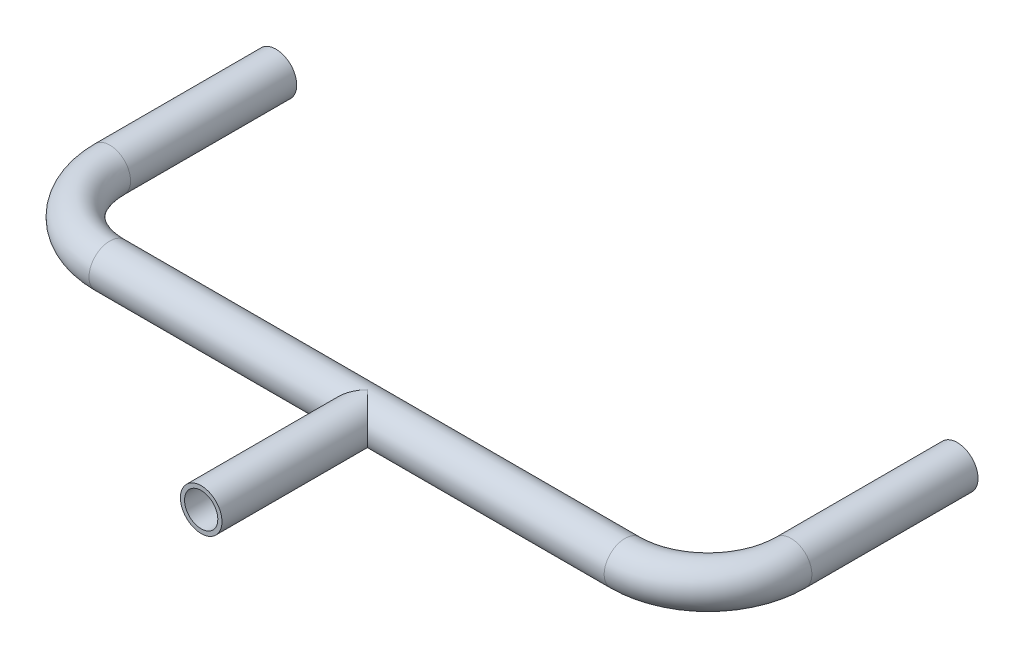
ISO-10303-21;
HEADER;
FILE_DESCRIPTION(('STEP AP214'),'2;1');
FILE_NAME('part.step','',(''),(''),'','','');
FILE_SCHEMA(('AUTOMOTIVE_DESIGN { 1 0 10303 214 1 1 1 1 }'));
ENDSEC;
DATA;
#1=APPLICATION_CONTEXT('core data for automotive mechanical design processes');
#2=APPLICATION_PROTOCOL_DEFINITION('international standard','automotive_design',2000,#1);
#3=PRODUCT_CONTEXT('',#1,'mechanical');
#4=PRODUCT('Part','Part','',(#3));
#5=PRODUCT_RELATED_PRODUCT_CATEGORY('part','',(#4));
#6=PRODUCT_DEFINITION_FORMATION('','',#4);
#7=PRODUCT_DEFINITION_CONTEXT('part definition',#1,'design');
#8=PRODUCT_DEFINITION('design','',#6,#7);
#9=PRODUCT_DEFINITION_SHAPE('','',#8);
#10=(LENGTH_UNIT() NAMED_UNIT(*) SI_UNIT(.MILLI.,.METRE.));
#11=(NAMED_UNIT(*) PLANE_ANGLE_UNIT() SI_UNIT($,.RADIAN.));
#12=(NAMED_UNIT(*) SI_UNIT($,.STERADIAN.) SOLID_ANGLE_UNIT());
#13=UNCERTAINTY_MEASURE_WITH_UNIT(LENGTH_MEASURE(1.E-05),#10,'distance_accuracy_value','');
#14=(GEOMETRIC_REPRESENTATION_CONTEXT(3) GLOBAL_UNCERTAINTY_ASSIGNED_CONTEXT((#13)) GLOBAL_UNIT_ASSIGNED_CONTEXT((#10,
#11,#12)) REPRESENTATION_CONTEXT('',''));
#15=CARTESIAN_POINT('',(0.,0.,0.));
#16=DIRECTION('',(0.,0.,1.));
#17=DIRECTION('',(1.,0.,0.));
#18=AXIS2_PLACEMENT_3D('',#15,#16,#17);
#19=CARTESIAN_POINT('',(-31.,0.,30.));
#20=DIRECTION('',(1.,0.,0.));
#21=DIRECTION('',(0.,0.,-1.));
#22=AXIS2_PLACEMENT_3D('',#19,#20,#21);
#23=CYLINDRICAL_SURFACE('',#22,2.5);
#24=CARTESIAN_POINT('',(31.,0.,30.));
#25=DIRECTION('',(1.,0.,0.));
#26=DIRECTION('',(0.,0.,-1.));
#27=AXIS2_PLACEMENT_3D('',#24,#25,#26);
#28=CIRCLE('',#27,2.5);
#29=CARTESIAN_POINT('',(31.,0.,32.5));
#30=VERTEX_POINT('',#29);
#31=EDGE_CURVE('E122',#30,#30,#28,.T.);
#32=ORIENTED_EDGE('',*,*,#31,.F.);
#33=EDGE_LOOP('',(#32));
#34=FACE_BOUND('',#33,.T.);
#35=CARTESIAN_POINT('',(-31.,0.,30.));
#36=DIRECTION('',(1.,0.,0.));
#37=DIRECTION('',(0.,0.,-1.));
#38=AXIS2_PLACEMENT_3D('',#35,#36,#37);
#39=CIRCLE('',#38,2.5);
#40=CARTESIAN_POINT('',(-31.,0.,32.5));
#41=VERTEX_POINT('',#40);
#42=EDGE_CURVE('E91',#41,#41,#39,.T.);
#43=ORIENTED_EDGE('',*,*,#42,.T.);
#44=EDGE_LOOP('',(#43));
#45=FACE_BOUND('',#44,.T.);
#46=CARTESIAN_POINT('',(0.,0.,30.));
#47=DIRECTION('',(0.707106781186547,0.,0.707106781186547));
#48=DIRECTION('',(0.707106781186547,0.,-0.707106781186547));
#49=AXIS2_PLACEMENT_3D('',#46,#47,#48);
#50=ELLIPSE('',#49,3.53553390593274,2.5);
#51=CARTESIAN_POINT('',(0.,-2.5,30.));
#52=VERTEX_POINT('',#51);
#53=CARTESIAN_POINT('',(0.,2.5,30.));
#54=VERTEX_POINT('',#53);
#55=EDGE_CURVE('E80',#52,#54,#50,.F.);
#56=ORIENTED_EDGE('',*,*,#55,.T.);
#57=CARTESIAN_POINT('',(0.,0.,30.));
#58=DIRECTION('',(0.707106781186547,0.,-0.707106781186547));
#59=DIRECTION('',(0.707106781186547,0.,0.707106781186547));
#60=AXIS2_PLACEMENT_3D('',#57,#58,#59);
#61=ELLIPSE('',#60,3.53553390593274,2.5);
#62=EDGE_CURVE('E84',#54,#52,#61,.T.);
#63=ORIENTED_EDGE('',*,*,#62,.T.);
#64=EDGE_LOOP('',(#56,#63));
#65=FACE_BOUND('',#64,.T.);
#66=ADVANCED_FACE('F32',(#34,#45,#65),#23,.T.);
#67=CARTESIAN_POINT('',(-31.,0.,30.));
#68=DIRECTION('',(1.,0.,0.));
#69=DIRECTION('',(0.,0.,-1.));
#70=AXIS2_PLACEMENT_3D('',#67,#68,#69);
#71=CYLINDRICAL_SURFACE('',#70,2.);
#72=CARTESIAN_POINT('',(31.,0.,30.));
#73=DIRECTION('',(1.,0.,0.));
#74=DIRECTION('',(0.,0.,-1.));
#75=AXIS2_PLACEMENT_3D('',#72,#73,#74);
#76=CIRCLE('',#75,2.);
#77=CARTESIAN_POINT('',(31.,0.,32.));
#78=VERTEX_POINT('',#77);
#79=EDGE_CURVE('E104',#78,#78,#76,.F.);
#80=ORIENTED_EDGE('',*,*,#79,.F.);
#81=EDGE_LOOP('',(#80));
#82=FACE_BOUND('',#81,.T.);
#83=CARTESIAN_POINT('',(-31.,0.,30.));
#84=DIRECTION('',(1.,0.,0.));
#85=DIRECTION('',(0.,0.,-1.));
#86=AXIS2_PLACEMENT_3D('',#83,#84,#85);
#87=CIRCLE('',#86,2.);
#88=CARTESIAN_POINT('',(-31.,0.,32.));
#89=VERTEX_POINT('',#88);
#90=EDGE_CURVE('E101',#89,#89,#87,.F.);
#91=ORIENTED_EDGE('',*,*,#90,.T.);
#92=EDGE_LOOP('',(#91));
#93=FACE_BOUND('',#92,.T.);
#94=CARTESIAN_POINT('',(-1.5,2.,30.));
#95=CARTESIAN_POINT('',(-1.49998071670638,2.00000627516937,30.0379479235646));
#96=CARTESIAN_POINT('',(-1.50144137076645,1.99891949492476,30.075871512533));
#97=CARTESIAN_POINT('',(-1.50714933485683,1.99462303531532,30.1513246169431));
#98=CARTESIAN_POINT('',(-1.51139191730073,1.99141695739297,30.1888546913848));
#99=CARTESIAN_POINT('',(-1.52788746872243,1.97882613787581,30.2994987253815));
#100=CARTESIAN_POINT('',(-1.54391814844851,1.96646480032562,30.3717328446597));
#101=CARTESIAN_POINT('',(-1.59071544702264,1.92893517586303,30.5374091033952));
#102=CARTESIAN_POINT('',(-1.6246999511635,1.90076994665306,30.629214039076));
#103=CARTESIAN_POINT('',(-1.70075265542759,1.83304379692473,30.8055806251053));
#104=CARTESIAN_POINT('',(-1.7428794008736,1.79339924041708,30.8900829810822));
#105=CARTESIAN_POINT('',(-1.81651421244187,1.71816854919065,31.0255826282879));
#106=CARTESIAN_POINT('',(-1.84710697283324,1.6853426756765,31.0786491229795));
#107=CARTESIAN_POINT('',(-1.90886067652254,1.61506745369567,31.181282951485));
#108=CARTESIAN_POINT('',(-1.94002181656417,1.57761647733983,31.2308490435649));
#109=CARTESIAN_POINT('',(-2.03288115304252,1.45858551233657,31.3740129581622));
#110=CARTESIAN_POINT('',(-2.09414231153167,1.37014665414417,31.462400823271));
#111=CARTESIAN_POINT('',(-2.19791485010884,1.19475582360513,31.607110183375));
#112=CARTESIAN_POINT('',(-2.241741950255,1.11094626427002,31.6663182510914));
#113=CARTESIAN_POINT('',(-2.32164150376076,0.93246548548185,31.7723542428322));
#114=CARTESIAN_POINT('',(-2.35772457759122,0.83780941839247,31.8191991427362));
#115=CARTESIAN_POINT('',(-2.41415746594965,0.655315349169776,31.8917140125323));
#116=CARTESIAN_POINT('',(-2.43610811513861,0.568851156485762,31.9195834564288));
#117=CARTESIAN_POINT('',(-2.47085927486564,0.391185851002287,31.9634989485972));
#118=CARTESIAN_POINT('',(-2.48366502634184,0.299987483557989,31.9795517691351));
#119=CARTESIAN_POINT('',(-2.4990797603455,0.115048014900808,31.9988581660746));
#120=CARTESIAN_POINT('',(-2.50165327583845,0.0212992015040264,32.0020672236063));
#121=CARTESIAN_POINT('',(-2.49626930125043,-0.165416909097576,31.9953356940993));
#122=CARTESIAN_POINT('',(-2.48831138631751,-0.258384174621453,31.9853945765651));
#123=CARTESIAN_POINT('',(-2.46328395209116,-0.435681508631683,31.9539323839974));
#124=CARTESIAN_POINT('',(-2.44673484453555,-0.520206139468481,31.933072188288));
#125=CARTESIAN_POINT('',(-2.4060460920134,-0.684168049314889,31.8813062431003));
#126=CARTESIAN_POINT('',(-2.38190416921523,-0.763603793047822,31.8503974789746));
#127=CARTESIAN_POINT('',(-2.3248586483438,-0.923537337819442,31.7763946792714));
#128=CARTESIAN_POINT('',(-2.2913346301469,-1.00339882615071,31.732412998301));
#129=CARTESIAN_POINT('',(-2.21893108833583,-1.15472609083026,31.6354493577565));
#130=CARTESIAN_POINT('',(-2.18004984452035,-1.22618915673876,31.5824645059909));
#131=CARTESIAN_POINT('',(-2.09056298155434,-1.374219156259,31.456977389318));
#132=CARTESIAN_POINT('',(-2.03919015114187,-1.44881598705261,31.3827019568768));
#133=CARTESIAN_POINT('',(-1.93498355899907,-1.58531375973435,31.2238391962422));
#134=CARTESIAN_POINT('',(-1.8821466322859,-1.64718428838877,31.1392279185878));
#135=CARTESIAN_POINT('',(-1.78430944617348,-1.75239685151697,30.9686015105409));
#136=CARTESIAN_POINT('',(-1.73904114834701,-1.79693944796438,30.883480110694));
#137=CARTESIAN_POINT('',(-1.65564578541579,-1.87404146815186,30.7051985783743));
#138=CARTESIAN_POINT('',(-1.61747301009034,-1.9066789985219,30.6120959805341));
#139=CARTESIAN_POINT('',(-1.57285021080349,-1.94330582467939,30.4746675585726));
#140=CARTESIAN_POINT('',(-1.56088839257271,-1.95289796969604,30.4335870884603));
#141=CARTESIAN_POINT('',(-1.53981243382236,-1.96955718049843,30.3502149250389));
#142=CARTESIAN_POINT('',(-1.53069622528697,-1.97662608056368,30.307924135832));
#143=CARTESIAN_POINT('',(-1.51569608167132,-1.98815564615197,30.2217041685705));
#144=CARTESIAN_POINT('',(-1.50986584980186,-1.99257304931841,30.1777596312184));
#145=CARTESIAN_POINT('',(-1.50199053830188,-1.99850713013867,30.0892218491835));
#146=CARTESIAN_POINT('',(-1.49995588749696,-2.00001581611392,30.0446271554933));
#147=CARTESIAN_POINT('',(-1.50000000000009,-2.00000000000002,30.));
#148=B_SPLINE_CURVE_WITH_KNOTS('',3,(#94,#95,#96,#97,#98,#99,#100,#101,#102,#103,#104,#105,#106,
#107,#108,#109,#110,#111,#112,#113,#114,#115,#116,#117,#118,#119,#120,#121,#122,#123,#124,#125,
#126,#127,#128,#129,#130,#131,#132,#133,#134,#135,#136,#137,#138,#139,#140,#141,#142,#143,#144,
#145,#146,#147),.UNSPECIFIED.,.F.,.F.,(4,2,2,2,2,2,2,2,2,2,2,2,2,2,2,2,2,2,2,2,2,2,2,2,2,2,4),
(0.,0.113757193471513,0.227321568172485,0.451299564493478,0.755254671739605,1.06148258973336,
1.26972686170817,1.47804463906282,1.89344715635985,2.22697671028542,2.56004588320835,
2.83923917448484,3.11827233148146,3.39827183597835,3.67828263637285,3.94302745220543,
4.20785176691214,4.49821446798836,4.78867062254808,5.13882801676877,5.48981273407111,
5.80751926470777,6.12310221470075,6.25450167031458,6.38580540927625,6.51919707877703,
6.65295472151385),.UNSPECIFIED.);
#149=CARTESIAN_POINT('',(-1.5,2.,30.));
#150=VERTEX_POINT('',#149);
#151=CARTESIAN_POINT('',(-1.5,-2.,30.));
#152=VERTEX_POINT('',#151);
#153=EDGE_CURVE('E36',#150,#152,#148,.T.);
#154=ORIENTED_EDGE('',*,*,#153,.T.);
#155=DIRECTION('',(1.,0.,0.));
#156=VECTOR('',#155,1.);
#157=CARTESIAN_POINT('',(-31.,-2.,30.));
#158=LINE('',#157,#156);
#159=CARTESIAN_POINT('',(0.,-2.,30.));
#160=VERTEX_POINT('',#159);
#161=EDGE_CURVE('E47',#152,#160,#158,.T.);
#162=ORIENTED_EDGE('',*,*,#161,.T.);
#163=CARTESIAN_POINT('',(1.5,-2.,30.));
#164=VERTEX_POINT('',#163);
#165=EDGE_CURVE('E133',#160,#164,#158,.T.);
#166=ORIENTED_EDGE('',*,*,#165,.T.);
#167=CARTESIAN_POINT('',(1.5,-2.,30.));
#168=CARTESIAN_POINT('',(1.49998071670638,-2.00000627516937,30.0379479235646));
#169=CARTESIAN_POINT('',(1.50144137076645,-1.99891949492476,30.075871512533));
#170=CARTESIAN_POINT('',(1.50714933485683,-1.99462303531532,30.1513246169431));
#171=CARTESIAN_POINT('',(1.51139191730073,-1.99141695739297,30.1888546913848));
#172=CARTESIAN_POINT('',(1.52788746872243,-1.97882613787581,30.2994987253815));
#173=CARTESIAN_POINT('',(1.54391814844851,-1.96646480032562,30.3717328446597));
#174=CARTESIAN_POINT('',(1.59071544702264,-1.92893517586303,30.5374091033952));
#175=CARTESIAN_POINT('',(1.6246999511635,-1.90076994665306,30.629214039076));
#176=CARTESIAN_POINT('',(1.70075265542759,-1.83304379692473,30.8055806251053));
#177=CARTESIAN_POINT('',(1.7428794008736,-1.79339924041708,30.8900829810822));
#178=CARTESIAN_POINT('',(1.81651421244187,-1.71816854919065,31.0255826282879));
#179=CARTESIAN_POINT('',(1.84710697283324,-1.6853426756765,31.0786491229795));
#180=CARTESIAN_POINT('',(1.90886067652254,-1.61506745369567,31.181282951485));
#181=CARTESIAN_POINT('',(1.94002181656417,-1.57761647733983,31.2308490435649));
#182=CARTESIAN_POINT('',(2.03288115304252,-1.45858551233657,31.3740129581622));
#183=CARTESIAN_POINT('',(2.09414231153167,-1.37014665414417,31.462400823271));
#184=CARTESIAN_POINT('',(2.19791485010884,-1.19475582360513,31.607110183375));
#185=CARTESIAN_POINT('',(2.241741950255,-1.11094626427002,31.6663182510914));
#186=CARTESIAN_POINT('',(2.32164150376076,-0.93246548548185,31.7723542428322));
#187=CARTESIAN_POINT('',(2.35772457759122,-0.83780941839247,31.8191991427362));
#188=CARTESIAN_POINT('',(2.41415746594965,-0.655315349169776,31.8917140125323));
#189=CARTESIAN_POINT('',(2.43610811513861,-0.568851156485762,31.9195834564288));
#190=CARTESIAN_POINT('',(2.47085927486564,-0.391185851002287,31.9634989485972));
#191=CARTESIAN_POINT('',(2.48366502634184,-0.299987483557989,31.9795517691351));
#192=CARTESIAN_POINT('',(2.4990797603455,-0.115048014900808,31.9988581660746));
#193=CARTESIAN_POINT('',(2.50165327583845,-0.0212992015040264,32.0020672236063));
#194=CARTESIAN_POINT('',(2.49626930125043,0.165416909097576,31.9953356940993));
#195=CARTESIAN_POINT('',(2.48831138631751,0.258384174621453,31.9853945765651));
#196=CARTESIAN_POINT('',(2.46328395209116,0.435681508631683,31.9539323839974));
#197=CARTESIAN_POINT('',(2.44673484453555,0.520206139468481,31.933072188288));
#198=CARTESIAN_POINT('',(2.4060460920134,0.684168049314889,31.8813062431003));
#199=CARTESIAN_POINT('',(2.38190416921523,0.763603793047822,31.8503974789746));
#200=CARTESIAN_POINT('',(2.3248586483438,0.923537337819442,31.7763946792714));
#201=CARTESIAN_POINT('',(2.2913346301469,1.00339882615071,31.732412998301));
#202=CARTESIAN_POINT('',(2.21893108833583,1.15472609083026,31.6354493577565));
#203=CARTESIAN_POINT('',(2.18004984452035,1.22618915673876,31.5824645059909));
#204=CARTESIAN_POINT('',(2.09056298155434,1.374219156259,31.456977389318));
#205=CARTESIAN_POINT('',(2.03919015114187,1.44881598705261,31.3827019568768));
#206=CARTESIAN_POINT('',(1.93498355899907,1.58531375973435,31.2238391962422));
#207=CARTESIAN_POINT('',(1.8821466322859,1.64718428838877,31.1392279185878));
#208=CARTESIAN_POINT('',(1.78430944617348,1.75239685151697,30.9686015105409));
#209=CARTESIAN_POINT('',(1.73904114834701,1.79693944796438,30.883480110694));
#210=CARTESIAN_POINT('',(1.65564578541579,1.87404146815186,30.7051985783743));
#211=CARTESIAN_POINT('',(1.61747301009034,1.9066789985219,30.6120959805341));
#212=CARTESIAN_POINT('',(1.57285021080349,1.94330582467939,30.4746675585726));
#213=CARTESIAN_POINT('',(1.56088839257271,1.95289796969604,30.4335870884603));
#214=CARTESIAN_POINT('',(1.53981243382236,1.96955718049843,30.3502149250389));
#215=CARTESIAN_POINT('',(1.53069622528697,1.97662608056368,30.307924135832));
#216=CARTESIAN_POINT('',(1.51569608167132,1.98815564615197,30.2217041685705));
#217=CARTESIAN_POINT('',(1.50986584980186,1.99257304931841,30.1777596312184));
#218=CARTESIAN_POINT('',(1.50199053830188,1.99850713013867,30.0892218491835));
#219=CARTESIAN_POINT('',(1.49995588749696,2.00001581611392,30.0446271554933));
#220=CARTESIAN_POINT('',(1.50000000000009,2.00000000000002,30.));
#221=B_SPLINE_CURVE_WITH_KNOTS('',3,(#167,#168,#169,#170,#171,#172,#173,#174,#175,#176,#177,
#178,#179,#180,#181,#182,#183,#184,#185,#186,#187,#188,#189,#190,#191,#192,#193,#194,#195,#196,
#197,#198,#199,#200,#201,#202,#203,#204,#205,#206,#207,#208,#209,#210,#211,#212,#213,#214,#215,
#216,#217,#218,#219,#220),.UNSPECIFIED.,.F.,.F.,(4,2,2,2,2,2,2,2,2,2,2,2,2,2,2,2,2,2,2,2,2,2,2,
2,2,2,4),(0.,0.113757193471513,0.227321568172485,0.451299564493478,0.755254671739605,
1.06148258973336,1.26972686170817,1.47804463906282,1.89344715635985,2.22697671028542,
2.56004588320835,2.83923917448484,3.11827233148146,3.39827183597835,3.67828263637285,
3.94302745220543,4.20785176691214,4.49821446798836,4.78867062254808,5.13882801676877,
5.48981273407111,5.80751926470777,6.12310221470075,6.25450167031458,6.38580540927625,
6.51919707877703,6.65295472151385),.UNSPECIFIED.);
#222=CARTESIAN_POINT('',(1.5,2.,30.));
#223=VERTEX_POINT('',#222);
#224=EDGE_CURVE('E135',#164,#223,#221,.T.);
#225=ORIENTED_EDGE('',*,*,#224,.T.);
#226=DIRECTION('',(1.,0.,0.));
#227=VECTOR('',#226,1.);
#228=CARTESIAN_POINT('',(-31.,2.,30.));
#229=LINE('',#228,#227);
#230=CARTESIAN_POINT('',(0.,2.,30.));
#231=VERTEX_POINT('',#230);
#232=EDGE_CURVE('E134',#223,#231,#229,.F.);
#233=ORIENTED_EDGE('',*,*,#232,.T.);
#234=EDGE_CURVE('E131',#231,#150,#229,.F.);
#235=ORIENTED_EDGE('',*,*,#234,.T.);
#236=EDGE_LOOP('',(#154,#162,#166,#225,#233,#235));
#237=FACE_BOUND('',#236,.T.);
#238=ADVANCED_FACE('F171',(#82,#93,#237),#71,.F.);
#239=CARTESIAN_POINT('',(-41.,0.,0.));
#240=DIRECTION('',(0.,0.,1.));
#241=DIRECTION('',(1.,0.,0.));
#242=AXIS2_PLACEMENT_3D('',#239,#240,#241);
#243=CYLINDRICAL_SURFACE('',#242,2.5);
#244=CARTESIAN_POINT('',(-41.,0.,20.));
#245=DIRECTION('',(0.,0.,1.));
#246=DIRECTION('',(1.,0.,0.));
#247=AXIS2_PLACEMENT_3D('',#244,#245,#246);
#248=CIRCLE('',#247,2.5);
#249=CARTESIAN_POINT('',(-43.5,0.,20.));
#250=VERTEX_POINT('',#249);
#251=EDGE_CURVE('E88',#250,#250,#248,.T.);
#252=ORIENTED_EDGE('',*,*,#251,.F.);
#253=EDGE_LOOP('',(#252));
#254=FACE_BOUND('',#253,.T.);
#255=CARTESIAN_POINT('',(-41.,0.,0.));
#256=DIRECTION('',(0.,0.,1.));
#257=DIRECTION('',(1.,0.,0.));
#258=AXIS2_PLACEMENT_3D('',#255,#256,#257);
#259=CIRCLE('',#258,2.5);
#260=CARTESIAN_POINT('',(-38.5,0.,0.));
#261=VERTEX_POINT('',#260);
#262=EDGE_CURVE('E116',#261,#261,#259,.T.);
#263=ORIENTED_EDGE('',*,*,#262,.T.);
#264=EDGE_LOOP('',(#263));
#265=FACE_BOUND('',#264,.T.);
#266=ADVANCED_FACE('F178',(#254,#265),#243,.T.);
#267=CARTESIAN_POINT('',(-31.,0.,20.));
#268=DIRECTION('',(0.,1.,0.));
#269=DIRECTION('',(0.,0.,1.));
#270=AXIS2_PLACEMENT_3D('',#267,#268,#269);
#271=TOROIDAL_SURFACE('',#270,10.,2.5);
#272=CARTESIAN_POINT('',(-31.,0.,20.));
#273=DIRECTION('',(0.,1.,0.));
#274=DIRECTION('',(0.,0.,1.));
#275=AXIS2_PLACEMENT_3D('',#272,#273,#274);
#276=CIRCLE('',#275,12.5);
#277=EDGE_CURVE('',#250,#41,#276,.T.);
#278=ORIENTED_EDGE('',*,*,#251,.T.);
#279=ORIENTED_EDGE('',*,*,#42,.F.);
#280=ORIENTED_EDGE('',*,*,#277,.T.);
#281=ORIENTED_EDGE('',*,*,#277,.F.);
#282=EDGE_LOOP('',(#278,#280,#279,#281));
#283=FACE_BOUND('',#282,.T.);
#284=ADVANCED_FACE('F227',(#283),#271,.T.);
#285=CARTESIAN_POINT('',(31.,0.,20.));
#286=DIRECTION('',(0.,1.,0.));
#287=DIRECTION('',(0.,0.,1.));
#288=AXIS2_PLACEMENT_3D('',#285,#286,#287);
#289=TOROIDAL_SURFACE('',#288,10.,2.5);
#290=CARTESIAN_POINT('',(41.,0.,20.));
#291=DIRECTION('',(0.,0.,-1.));
#292=DIRECTION('',(-1.,0.,0.));
#293=AXIS2_PLACEMENT_3D('',#290,#291,#292);
#294=CIRCLE('',#293,2.5);
#295=CARTESIAN_POINT('',(43.5,0.,20.));
#296=VERTEX_POINT('',#295);
#297=EDGE_CURVE('E118',#296,#296,#294,.T.);
#298=CARTESIAN_POINT('',(31.,0.,20.));
#299=DIRECTION('',(0.,1.,0.));
#300=DIRECTION('',(0.,0.,1.));
#301=AXIS2_PLACEMENT_3D('',#298,#299,#300);
#302=CIRCLE('',#301,12.5);
#303=EDGE_CURVE('',#30,#296,#302,.T.);
#304=ORIENTED_EDGE('',*,*,#31,.T.);
#305=ORIENTED_EDGE('',*,*,#297,.F.);
#306=ORIENTED_EDGE('',*,*,#303,.T.);
#307=ORIENTED_EDGE('',*,*,#303,.F.);
#308=EDGE_LOOP('',(#304,#306,#305,#307));
#309=FACE_BOUND('',#308,.T.);
#310=ADVANCED_FACE('F233',(#309),#289,.T.);
#311=CARTESIAN_POINT('',(41.,0.,20.));
#312=DIRECTION('',(0.,0.,-1.));
#313=DIRECTION('',(-1.,0.,0.));
#314=AXIS2_PLACEMENT_3D('',#311,#312,#313);
#315=CYLINDRICAL_SURFACE('',#314,2.5);
#316=CARTESIAN_POINT('',(41.,0.,0.));
#317=DIRECTION('',(0.,0.,-1.));
#318=DIRECTION('',(-1.,0.,0.));
#319=AXIS2_PLACEMENT_3D('',#316,#317,#318);
#320=CIRCLE('',#319,2.5);
#321=CARTESIAN_POINT('',(38.5,0.,0.));
#322=VERTEX_POINT('',#321);
#323=EDGE_CURVE('E98',#322,#322,#320,.T.);
#324=ORIENTED_EDGE('',*,*,#323,.F.);
#325=EDGE_LOOP('',(#324));
#326=FACE_BOUND('',#325,.T.);
#327=ORIENTED_EDGE('',*,*,#297,.T.);
#328=EDGE_LOOP('',(#327));
#329=FACE_BOUND('',#328,.T.);
#330=ADVANCED_FACE('F34',(#326,#329),#315,.T.);
#331=CARTESIAN_POINT('',(-41.,0.,0.));
#332=DIRECTION('',(0.,0.,1.));
#333=DIRECTION('',(1.,0.,0.));
#334=AXIS2_PLACEMENT_3D('',#331,#332,#333);
#335=PLANE('',#334);
#336=CARTESIAN_POINT('',(-41.,0.,0.));
#337=DIRECTION('',(0.,0.,1.));
#338=DIRECTION('',(1.,0.,0.));
#339=AXIS2_PLACEMENT_3D('',#336,#337,#338);
#340=CIRCLE('',#339,2.);
#341=CARTESIAN_POINT('',(-39.,0.,0.));
#342=VERTEX_POINT('',#341);
#343=EDGE_CURVE('E94',#342,#342,#340,.F.);
#344=ORIENTED_EDGE('',*,*,#343,.F.);
#345=EDGE_LOOP('',(#344));
#346=FACE_BOUND('',#345,.T.);
#347=ORIENTED_EDGE('',*,*,#262,.F.);
#348=EDGE_LOOP('',(#347));
#349=FACE_BOUND('',#348,.T.);
#350=ADVANCED_FACE('F238',(#346,#349),#335,.F.);
#351=CARTESIAN_POINT('',(41.,0.,0.));
#352=DIRECTION('',(0.,0.,-1.));
#353=DIRECTION('',(-1.,0.,0.));
#354=AXIS2_PLACEMENT_3D('',#351,#352,#353);
#355=PLANE('',#354);
#356=CARTESIAN_POINT('',(41.,0.,0.));
#357=DIRECTION('',(0.,0.,-1.));
#358=DIRECTION('',(-1.,0.,0.));
#359=AXIS2_PLACEMENT_3D('',#356,#357,#358);
#360=CIRCLE('',#359,2.);
#361=CARTESIAN_POINT('',(39.,0.,0.));
#362=VERTEX_POINT('',#361);
#363=EDGE_CURVE('E110',#362,#362,#360,.F.);
#364=ORIENTED_EDGE('',*,*,#363,.T.);
#365=EDGE_LOOP('',(#364));
#366=FACE_BOUND('',#365,.T.);
#367=ORIENTED_EDGE('',*,*,#323,.T.);
#368=EDGE_LOOP('',(#367));
#369=FACE_BOUND('',#368,.T.);
#370=ADVANCED_FACE('F158',(#366,#369),#355,.T.);
#371=CARTESIAN_POINT('',(-41.,0.,0.));
#372=DIRECTION('',(0.,0.,1.));
#373=DIRECTION('',(1.,0.,0.));
#374=AXIS2_PLACEMENT_3D('',#371,#372,#373);
#375=CYLINDRICAL_SURFACE('',#374,2.);
#376=CARTESIAN_POINT('',(-41.,0.,20.));
#377=DIRECTION('',(0.,0.,1.));
#378=DIRECTION('',(1.,0.,0.));
#379=AXIS2_PLACEMENT_3D('',#376,#377,#378);
#380=CIRCLE('',#379,2.);
#381=CARTESIAN_POINT('',(-43.,0.,20.));
#382=VERTEX_POINT('',#381);
#383=EDGE_CURVE('E97',#382,#382,#380,.F.);
#384=ORIENTED_EDGE('',*,*,#383,.F.);
#385=EDGE_LOOP('',(#384));
#386=FACE_BOUND('',#385,.T.);
#387=ORIENTED_EDGE('',*,*,#343,.T.);
#388=EDGE_LOOP('',(#387));
#389=FACE_BOUND('',#388,.T.);
#390=ADVANCED_FACE('F154',(#386,#389),#375,.F.);
#391=CARTESIAN_POINT('',(-31.,0.,20.));
#392=DIRECTION('',(0.,1.,0.));
#393=DIRECTION('',(0.,0.,1.));
#394=AXIS2_PLACEMENT_3D('',#391,#392,#393);
#395=TOROIDAL_SURFACE('',#394,10.,2.);
#396=CARTESIAN_POINT('',(-31.,0.,20.));
#397=DIRECTION('',(0.,1.,0.));
#398=DIRECTION('',(0.,0.,1.));
#399=AXIS2_PLACEMENT_3D('',#396,#397,#398);
#400=CIRCLE('',#399,12.);
#401=EDGE_CURVE('',#382,#89,#400,.T.);
#402=ORIENTED_EDGE('',*,*,#383,.T.);
#403=ORIENTED_EDGE('',*,*,#90,.F.);
#404=ORIENTED_EDGE('',*,*,#401,.T.);
#405=ORIENTED_EDGE('',*,*,#401,.F.);
#406=EDGE_LOOP('',(#402,#404,#403,#405));
#407=FACE_BOUND('',#406,.T.);
#408=ADVANCED_FACE('F157',(#407),#395,.F.);
#409=CARTESIAN_POINT('',(31.,0.,20.));
#410=DIRECTION('',(0.,1.,0.));
#411=DIRECTION('',(0.,0.,1.));
#412=AXIS2_PLACEMENT_3D('',#409,#410,#411);
#413=TOROIDAL_SURFACE('',#412,10.,2.);
#414=CARTESIAN_POINT('',(41.,0.,20.));
#415=DIRECTION('',(0.,0.,-1.));
#416=DIRECTION('',(-1.,0.,0.));
#417=AXIS2_PLACEMENT_3D('',#414,#415,#416);
#418=CIRCLE('',#417,2.);
#419=CARTESIAN_POINT('',(43.,0.,20.));
#420=VERTEX_POINT('',#419);
#421=EDGE_CURVE('E107',#420,#420,#418,.F.);
#422=CARTESIAN_POINT('',(31.,0.,20.));
#423=DIRECTION('',(0.,1.,0.));
#424=DIRECTION('',(0.,0.,1.));
#425=AXIS2_PLACEMENT_3D('',#422,#423,#424);
#426=CIRCLE('',#425,12.);
#427=EDGE_CURVE('',#78,#420,#426,.T.);
#428=ORIENTED_EDGE('',*,*,#79,.T.);
#429=ORIENTED_EDGE('',*,*,#421,.F.);
#430=ORIENTED_EDGE('',*,*,#427,.T.);
#431=ORIENTED_EDGE('',*,*,#427,.F.);
#432=EDGE_LOOP('',(#428,#430,#429,#431));
#433=FACE_BOUND('',#432,.T.);
#434=ADVANCED_FACE('F161',(#433),#413,.F.);
#435=CARTESIAN_POINT('',(41.,0.,20.));
#436=DIRECTION('',(0.,0.,-1.));
#437=DIRECTION('',(-1.,0.,0.));
#438=AXIS2_PLACEMENT_3D('',#435,#436,#437);
#439=CYLINDRICAL_SURFACE('',#438,2.);
#440=ORIENTED_EDGE('',*,*,#363,.F.);
#441=EDGE_LOOP('',(#440));
#442=FACE_BOUND('',#441,.T.);
#443=ORIENTED_EDGE('',*,*,#421,.T.);
#444=EDGE_LOOP('',(#443));
#445=FACE_BOUND('',#444,.T.);
#446=ADVANCED_FACE('F166',(#442,#445),#439,.F.);
#447=CARTESIAN_POINT('',(0.,0.,50.));
#448=DIRECTION('',(0.,0.,-1.));
#449=DIRECTION('',(-1.,0.,0.));
#450=AXIS2_PLACEMENT_3D('',#447,#448,#449);
#451=CYLINDRICAL_SURFACE('',#450,2.);
#452=CARTESIAN_POINT('',(0.,0.,30.));
#453=DIRECTION('',(0.,0.,1.));
#454=DIRECTION('',(1.,0.,0.));
#455=AXIS2_PLACEMENT_3D('',#452,#453,#454);
#456=CIRCLE('',#455,2.);
#457=EDGE_CURVE('E61',#231,#160,#456,.T.);
#458=ORIENTED_EDGE('',*,*,#457,.F.);
#459=CARTESIAN_POINT('',(0.,0.,30.));
#460=DIRECTION('',(0.707106781186547,0.,0.707106781186547));
#461=DIRECTION('',(0.707106781186547,0.,-0.707106781186547));
#462=AXIS2_PLACEMENT_3D('',#459,#460,#461);
#463=ELLIPSE('',#462,2.82842712474619,2.);
#464=EDGE_CURVE('E113',#231,#160,#463,.T.);
#465=ORIENTED_EDGE('',*,*,#464,.T.);
#466=EDGE_LOOP('',(#458,#465));
#467=FACE_BOUND('',#466,.T.);
#468=ADVANCED_FACE('F197',(#467),#451,.F.);
#469=CARTESIAN_POINT('',(0.,0.,50.));
#470=DIRECTION('',(0.,0.,-1.));
#471=DIRECTION('',(-1.,0.,0.));
#472=AXIS2_PLACEMENT_3D('',#469,#470,#471);
#473=CYLINDRICAL_SURFACE('',#472,2.5);
#474=ORIENTED_EDGE('',*,*,#153,.F.);
#475=CARTESIAN_POINT('',(0.,0.,30.));
#476=DIRECTION('',(0.,0.,1.));
#477=DIRECTION('',(1.,0.,0.));
#478=AXIS2_PLACEMENT_3D('',#475,#476,#477);
#479=CIRCLE('',#478,2.5);
#480=EDGE_CURVE('E205',#150,#152,#479,.T.);
#481=ORIENTED_EDGE('',*,*,#480,.T.);
#482=EDGE_LOOP('',(#474,#481));
#483=FACE_BOUND('',#482,.T.);
#484=ADVANCED_FACE('F151',(#483),#473,.T.);
#485=CARTESIAN_POINT('',(0.,0.,30.));
#486=DIRECTION('',(0.,0.,1.));
#487=DIRECTION('',(1.,0.,0.));
#488=AXIS2_PLACEMENT_3D('',#485,#486,#487);
#489=PLANE('',#488);
#490=ORIENTED_EDGE('',*,*,#161,.F.);
#491=ORIENTED_EDGE('',*,*,#480,.F.);
#492=ORIENTED_EDGE('',*,*,#234,.F.);
#493=ORIENTED_EDGE('',*,*,#457,.T.);
#494=EDGE_LOOP('',(#490,#491,#492,#493));
#495=FACE_BOUND('',#494,.T.);
#496=ADVANCED_FACE('F220',(#495),#489,.F.);
#497=CARTESIAN_POINT('',(0.,0.,30.));
#498=DIRECTION('',(0.707106781186547,0.,-0.707106781186547));
#499=DIRECTION('',(0.707106781186547,0.,0.707106781186547));
#500=AXIS2_PLACEMENT_3D('',#497,#498,#499);
#501=ELLIPSE('',#500,2.82842712474619,2.);
#502=EDGE_CURVE('E128',#160,#231,#501,.F.);
#503=ORIENTED_EDGE('',*,*,#502,.F.);
#504=ORIENTED_EDGE('',*,*,#464,.F.);
#505=EDGE_LOOP('',(#503,#504));
#506=FACE_BOUND('',#505,.T.);
#507=ADVANCED_FACE('F140',(#506),#71,.F.);
#508=ORIENTED_EDGE('',*,*,#224,.F.);
#509=EDGE_CURVE('E202',#164,#223,#479,.T.);
#510=ORIENTED_EDGE('',*,*,#509,.T.);
#511=EDGE_LOOP('',(#508,#510));
#512=FACE_BOUND('',#511,.T.);
#513=ADVANCED_FACE('F144',(#512),#473,.T.);
#514=EDGE_CURVE('E207',#160,#231,#456,.T.);
#515=ORIENTED_EDGE('',*,*,#514,.F.);
#516=ORIENTED_EDGE('',*,*,#502,.T.);
#517=EDGE_LOOP('',(#515,#516));
#518=FACE_BOUND('',#517,.T.);
#519=ADVANCED_FACE('F149',(#518),#451,.F.);
#520=ORIENTED_EDGE('',*,*,#165,.F.);
#521=ORIENTED_EDGE('',*,*,#514,.T.);
#522=ORIENTED_EDGE('',*,*,#232,.F.);
#523=ORIENTED_EDGE('',*,*,#509,.F.);
#524=EDGE_LOOP('',(#520,#521,#522,#523));
#525=FACE_BOUND('',#524,.T.);
#526=ADVANCED_FACE('F152',(#525),#489,.F.);
#527=ORIENTED_EDGE('',*,*,#62,.F.);
#528=ORIENTED_EDGE('',*,*,#55,.F.);
#529=EDGE_LOOP('',(#527,#528));
#530=FACE_BOUND('',#529,.T.);
#531=CARTESIAN_POINT('',(0.,0.,50.));
#532=DIRECTION('',(0.,0.,1.));
#533=DIRECTION('',(1.,0.,0.));
#534=AXIS2_PLACEMENT_3D('',#531,#532,#533);
#535=CIRCLE('',#534,2.5);
#536=CARTESIAN_POINT('',(2.5,0.,50.));
#537=VERTEX_POINT('',#536);
#538=EDGE_CURVE('E86',#537,#537,#535,.T.);
#539=ORIENTED_EDGE('',*,*,#538,.F.);
#540=EDGE_LOOP('',(#539));
#541=FACE_BOUND('',#540,.T.);
#542=ADVANCED_FACE('F82',(#530,#541),#473,.T.);
#543=CARTESIAN_POINT('',(-2.,0.,32.5));
#544=CARTESIAN_POINT('',(-1.99999242056707,0.0959968964388691,32.499992649474));
#545=CARTESIAN_POINT('',(-1.99303057133644,0.192133192964673,32.4944136841191));
#546=CARTESIAN_POINT('',(-1.96565005995827,0.381319365477407,32.472592693606));
#547=CARTESIAN_POINT('',(-1.94520162873807,0.474361934321336,32.4563270800038));
#548=CARTESIAN_POINT('',(-1.89232172110493,0.654094916824507,32.4146672181517));
#549=CARTESIAN_POINT('',(-1.85996664856862,0.740821698128047,32.3893312014417));
#550=CARTESIAN_POINT('',(-1.78488265652265,0.906926323692543,32.331360109966));
#551=CARTESIAN_POINT('',(-1.74215370414941,0.986304144671505,32.2987250120775));
#552=CARTESIAN_POINT('',(-1.63137163496894,1.16318123656703,32.2157566472895));
#553=CARTESIAN_POINT('',(-1.55968108482594,1.25736767952115,32.1632174860322));
#554=CARTESIAN_POINT('',(-1.4027219342605,1.43041367827883,32.0529219260303));
#555=CARTESIAN_POINT('',(-1.31741424649663,1.50922761533153,31.9951507220051));
#556=CARTESIAN_POINT('',(-1.13322601592733,1.6521591895554,31.8785600162984));
#557=CARTESIAN_POINT('',(-1.03415322702388,1.71602638457222,31.8197383090203));
#558=CARTESIAN_POINT('',(-0.82346121749581,1.82646834413604,31.7088210988299));
#559=CARTESIAN_POINT('',(-0.711885666112008,1.87310099386401,31.6567034708917));
#560=CARTESIAN_POINT('',(-0.526121048323021,1.93086043771819,31.5883565230093));
#561=CARTESIAN_POINT('',(-0.456188262019711,1.94865475820658,31.5662872777019));
#562=CARTESIAN_POINT('',(-0.312787315879537,1.9767339679833,31.5306988915583));
#563=CARTESIAN_POINT('',(-0.239328326475009,1.98703731881776,31.5171587417974));
#564=CARTESIAN_POINT('',(-0.0898074811289664,1.99939840142554,31.500842340611));
#565=CARTESIAN_POINT('',(-0.0137285151792098,2.00138345613423,31.4981609692656));
#566=CARTESIAN_POINT('',(0.13770489203274,1.99669481699685,31.5043996230281));
#567=CARTESIAN_POINT('',(0.213058665766293,1.99001379511087,31.5133294666024));
#568=CARTESIAN_POINT('',(0.372222302612724,1.9669530271194,31.5432072129997));
#569=CARTESIAN_POINT('',(0.455508006053996,1.94921808205621,31.5658184204953));
#570=CARTESIAN_POINT('',(0.616535559537029,1.90444547348848,31.6199745993628));
#571=CARTESIAN_POINT('',(0.694260156539816,1.87738025642251,31.6515459819864));
#572=CARTESIAN_POINT('',(0.880662106040971,1.79974102194077,31.7365611615942));
#573=CARTESIAN_POINT('',(0.98580269830418,1.74414886595504,31.7931337296815));
#574=CARTESIAN_POINT('',(1.18371667779933,1.61638467497538,31.9091378006069));
#575=CARTESIAN_POINT('',(1.27647172084353,1.54418846902465,31.9685733704894));
#576=CARTESIAN_POINT('',(1.45127477140507,1.38145818326397,32.0861275196845));
#577=CARTESIAN_POINT('',(1.53297192230577,1.29048701026968,32.1441688926078));
#578=CARTESIAN_POINT('',(1.6800994994343,1.09198491072667,32.2517187149499));
#579=CARTESIAN_POINT('',(1.74557351611723,0.984499645201087,32.3012499182245));
#580=CARTESIAN_POINT('',(1.84056284740989,0.787777814380568,32.3742458564332));
#581=CARTESIAN_POINT('',(1.87500450443907,0.702177727329215,32.4011107122417));
#582=CARTESIAN_POINT('',(1.93212645098797,0.524913923737162,32.4459756411142));
#583=CARTESIAN_POINT('',(1.95481560494548,0.433254836272294,32.4639823949691));
#584=CARTESIAN_POINT('',(1.98713854693579,0.245713233844938,32.4897033568521));
#585=CARTESIAN_POINT('',(1.99670412474496,0.149811307212627,32.4973637863367));
#586=CARTESIAN_POINT('',(2.00185904897629,-0.042608002867508,32.5014868270186));
#587=CARTESIAN_POINT('',(1.99745099882206,-0.139125268327953,32.4979515240906));
#588=CARTESIAN_POINT('',(1.97591718375232,-0.321746674155454,32.4807685864295));
#589=CARTESIAN_POINT('',(1.95985082486099,-0.408060891756557,32.4679635240506));
#590=CARTESIAN_POINT('',(1.91712781889844,-0.576335674228712,32.4341751321347));
#591=CARTESIAN_POINT('',(1.89046802890338,-0.658294938856933,32.4131893755344));
#592=CARTESIAN_POINT('',(1.82584962821608,-0.821235877548901,32.3628984943133));
#593=CARTESIAN_POINT('',(1.78729421404364,-0.901843619419045,32.3331591273687));
#594=CARTESIAN_POINT('',(1.70113784836722,-1.0554100044833,32.2678362272214));
#595=CARTESIAN_POINT('',(1.65353644576546,-1.12836826593787,32.2322524025842));
#596=CARTESIAN_POINT('',(1.54077568170313,-1.27925237569142,32.149936875224));
#597=CARTESIAN_POINT('',(1.47399830951701,-1.35550718978128,32.1023696976822));
#598=CARTESIAN_POINT('',(1.33061303862902,-1.49653687597529,32.0044349795202));
#599=CARTESIAN_POINT('',(1.25397716316118,-1.56127777727366,31.954059709911));
#600=CARTESIAN_POINT('',(1.12356555676342,-1.65568487930787,31.8737413531714));
#601=CARTESIAN_POINT('',(1.07263940924668,-1.68913741792651,31.8435474368546));
#602=CARTESIAN_POINT('',(0.967377738576417,-1.75155001920543,31.7843541552113));
#603=CARTESIAN_POINT('',(0.913040428119218,-1.78050769868975,31.7553554295189));
#604=CARTESIAN_POINT('',(0.801125159718352,-1.83358089959817,31.69983828793));
#605=CARTESIAN_POINT('',(0.743560232756326,-1.85771431687654,31.6733109077484));
#606=CARTESIAN_POINT('',(0.624991021496029,-1.90088481958634,31.6241020986769));
#607=CARTESIAN_POINT('',(0.563989262480474,-1.9199255893155,31.6014178938043));
#608=CARTESIAN_POINT('',(0.433913275762213,-1.95360165889083,31.5601942022258));
#609=CARTESIAN_POINT('',(0.364577335059662,-1.96779559724998,31.5420971671478));
#610=CARTESIAN_POINT('',(0.223162387261959,-1.98878905619367,31.5149337159379));
#611=CARTESIAN_POINT('',(0.151090779549527,-1.99560723074758,31.5058445230753));
#612=CARTESIAN_POINT('',(0.00565129453593314,-2.00132058716546,31.4982473677972));
#613=CARTESIAN_POINT('',(-0.0677214541541487,-2.0001731977979,31.4997962591844));
#614=CARTESIAN_POINT('',(-0.212984193023094,-1.98996519544204,31.5133077169599));
#615=CARTESIAN_POINT('',(-0.284871647326092,-1.98089203653787,31.5252867934739));
#616=CARTESIAN_POINT('',(-0.444606774344548,-1.95207745752715,31.5620707675608));
#617=CARTESIAN_POINT('',(-0.531423082491113,-1.93009230408643,31.5894925841937));
#618=CARTESIAN_POINT('',(-0.698633478689628,-1.87608177217432,31.6528890764241));
#619=CARTESIAN_POINT('',(-0.779007760036705,-1.84402681542564,31.6888888721129));
#620=CARTESIAN_POINT('',(-0.912177722046141,-1.78094746311468,31.7549115872444));
#621=CARTESIAN_POINT('',(-0.966519181518278,-1.7520236319041,31.7838890732501));
#622=CARTESIAN_POINT('',(-1.07183822981725,-1.68964733782464,31.84307948739));
#623=CARTESIAN_POINT('',(-1.12281458495114,-1.65619322765904,31.8732928621151));
#624=CARTESIAN_POINT('',(-1.27077940329881,-1.54918435570712,31.9643799775812));
#625=CARTESIAN_POINT('',(-1.36279868666246,-1.46898541640511,32.025698084814));
#626=CARTESIAN_POINT('',(-1.53338946483075,-1.29001718858432,32.1441827878711));
#627=CARTESIAN_POINT('',(-1.61177022423678,-1.1910196615765,32.201284919641));
#628=CARTESIAN_POINT('',(-1.71557672941678,-1.02998399899549,32.2787465080453));
#629=CARTESIAN_POINT('',(-1.74786844413511,-0.974255400199712,32.3031886810933));
#630=CARTESIAN_POINT('',(-1.80736810096138,-0.858854828628061,32.348661154656));
#631=CARTESIAN_POINT('',(-1.8345791544845,-0.799185299805379,32.3696935422891));
#632=CARTESIAN_POINT('',(-1.8917800598956,-0.655037739424261,32.414209055115));
#633=CARTESIAN_POINT('',(-1.91948267180093,-0.569110239590134,32.4360289288763));
#634=CARTESIAN_POINT('',(-1.9631576733877,-0.392713097427736,32.4705886497684));
#635=CARTESIAN_POINT('',(-1.97916078877459,-0.302256024103152,32.4833522781687));
#636=CARTESIAN_POINT('',(-1.9925630255603,-0.175880930919924,32.494053783091));
#637=CARTESIAN_POINT('',(-1.99534737874577,-0.140808552821283,32.4962791876343));
#638=CARTESIAN_POINT('',(-1.99906746352746,-0.0704970748918334,32.499253810179));
#639=CARTESIAN_POINT('',(-2.00000278378988,-0.0352579397117369,32.5000026997165));
#640=CARTESIAN_POINT('',(-2.,0.,32.5));
#641=B_SPLINE_CURVE_WITH_KNOTS('',3,(#543,#544,#545,#546,#547,#548,#549,#550,#551,#552,#553,
#554,#555,#556,#557,#558,#559,#560,#561,#562,#563,#564,#565,#566,#567,#568,#569,#570,#571,#572,
#573,#574,#575,#576,#577,#578,#579,#580,#581,#582,#583,#584,#585,#586,#587,#588,#589,#590,#591,
#592,#593,#594,#595,#596,#597,#598,#599,#600,#601,#602,#603,#604,#605,#606,#607,#608,#609,#610,
#611,#612,#613,#614,#615,#616,#617,#618,#619,#620,#621,#622,#623,#624,#625,#626,#627,#628,#629,
#630,#631,#632,#633,#634,#635,#636,#637,#638,#639,#640),.UNSPECIFIED.,.T.,.F.,(4,2,2,2,2,2,2,2,
2,2,2,2,2,2,2,2,2,2,2,2,2,2,2,2,2,2,2,2,2,2,2,2,2,2,2,2,2,2,2,2,2,2,2,2,2,2,2,2,4),(0.,
0.287836605992208,0.576310692639342,0.862965057250606,1.14962032997081,1.53607888200101,
1.92366738187851,2.31734741765481,2.70969292925127,2.93534486341129,3.1604387740811,
3.38749528500758,3.61474392028822,3.8775863003201,4.14121163495705,4.534257481883,
4.92787915886673,5.33198173288418,5.73498644040675,6.02213978124801,6.30907621738867,
6.59749843639963,6.8858669226877,7.15087004938158,7.41595185759571,7.69742753051564,
7.97891724351348,8.31365537249324,8.64936529970901,8.85316560745905,9.05707360380849,
9.26021055202077,9.4632001399658,9.68152133432595,9.89928907450683,10.1182215471167,
10.3375012031536,10.616933053181,10.8971934831173,11.1010640012511,11.3050088506911,
11.7129165318148,12.1261363563906,12.3324811048119,12.5386990694968,12.8161540735934,
13.0928777702216,13.1985714874516,13.3042887145431),.UNSPECIFIED.);
#642=CARTESIAN_POINT('',(-2.,0.,32.5));
#643=VERTEX_POINT('',#642);
#644=EDGE_CURVE('E11',#643,#643,#641,.T.);
#645=ORIENTED_EDGE('',*,*,#644,.T.);
#646=EDGE_LOOP('',(#645));
#647=FACE_BOUND('',#646,.T.);
#648=CARTESIAN_POINT('',(0.,0.,50.));
#649=DIRECTION('',(0.,0.,1.));
#650=DIRECTION('',(1.,0.,0.));
#651=AXIS2_PLACEMENT_3D('',#648,#649,#650);
#652=CIRCLE('',#651,2.);
#653=CARTESIAN_POINT('',(2.,0.,50.));
#654=VERTEX_POINT('',#653);
#655=EDGE_CURVE('E200',#654,#654,#652,.T.);
#656=ORIENTED_EDGE('',*,*,#655,.T.);
#657=EDGE_LOOP('',(#656));
#658=FACE_BOUND('',#657,.T.);
#659=ADVANCED_FACE('F190',(#647,#658),#451,.F.);
#660=CARTESIAN_POINT('',(0.,0.,50.));
#661=DIRECTION('',(0.,0.,1.));
#662=DIRECTION('',(1.,0.,0.));
#663=AXIS2_PLACEMENT_3D('',#660,#661,#662);
#664=PLANE('',#663);
#665=ORIENTED_EDGE('',*,*,#538,.T.);
#666=EDGE_LOOP('',(#665));
#667=FACE_BOUND('',#666,.T.);
#668=ORIENTED_EDGE('',*,*,#655,.F.);
#669=EDGE_LOOP('',(#668));
#670=FACE_BOUND('',#669,.T.);
#671=ADVANCED_FACE('F185',(#667,#670),#664,.T.);
#672=ORIENTED_EDGE('',*,*,#644,.F.);
#673=EDGE_LOOP('',(#672));
#674=FACE_BOUND('',#673,.T.);
#675=ADVANCED_FACE('F174',(#674),#23,.T.);
#676=CLOSED_SHELL('',(#66,#238,#266,#284,#310,#330,#350,#370,#390,#408,#434,#446,#468,#484,#496,
#507,#513,#519,#526,#542,#659,#671,#675));
#677=MANIFOLD_SOLID_BREP('B2',#676);
#678=ADVANCED_BREP_SHAPE_REPRESENTATION('',(#18,#677),#14);
#679=SHAPE_DEFINITION_REPRESENTATION(#9,#678);
ENDSEC;
END-ISO-10303-21;
